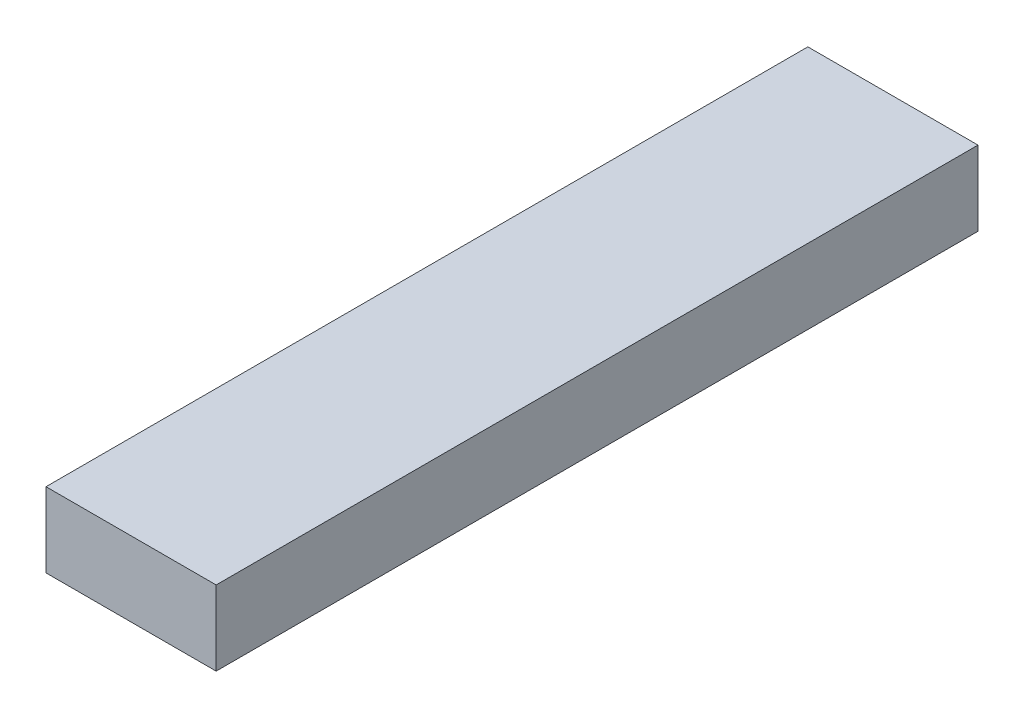
ISO-10303-21;
HEADER;
FILE_DESCRIPTION(('STEP AP214'),'2;1');
FILE_NAME('part.step','',(''),(''),'','','');
FILE_SCHEMA(('AUTOMOTIVE_DESIGN { 1 0 10303 214 1 1 1 1 }'));
ENDSEC;
DATA;
#1=APPLICATION_CONTEXT('core data for automotive mechanical design processes');
#2=APPLICATION_PROTOCOL_DEFINITION('international standard','automotive_design',2000,#1);
#3=PRODUCT_CONTEXT('',#1,'mechanical');
#4=PRODUCT('Part','Part','',(#3));
#5=PRODUCT_RELATED_PRODUCT_CATEGORY('part','',(#4));
#6=PRODUCT_DEFINITION_FORMATION('','',#4);
#7=PRODUCT_DEFINITION_CONTEXT('part definition',#1,'design');
#8=PRODUCT_DEFINITION('design','',#6,#7);
#9=PRODUCT_DEFINITION_SHAPE('','',#8);
#10=(LENGTH_UNIT() NAMED_UNIT(*) SI_UNIT(.MILLI.,.METRE.));
#11=(NAMED_UNIT(*) PLANE_ANGLE_UNIT() SI_UNIT($,.RADIAN.));
#12=(NAMED_UNIT(*) SI_UNIT($,.STERADIAN.) SOLID_ANGLE_UNIT());
#13=UNCERTAINTY_MEASURE_WITH_UNIT(LENGTH_MEASURE(1.E-05),#10,'distance_accuracy_value','');
#14=(GEOMETRIC_REPRESENTATION_CONTEXT(3) GLOBAL_UNCERTAINTY_ASSIGNED_CONTEXT((#13)) GLOBAL_UNIT_ASSIGNED_CONTEXT((#10,
#11,#12)) REPRESENTATION_CONTEXT('',''));
#15=CARTESIAN_POINT('',(0.,0.,0.));
#16=DIRECTION('',(0.,0.,1.));
#17=DIRECTION('',(1.,0.,0.));
#18=AXIS2_PLACEMENT_3D('',#15,#16,#17);
#19=CARTESIAN_POINT('',(17.018,-7.4676,76.2));
#20=DIRECTION('',(-1.,0.,0.));
#21=DIRECTION('',(0.,0.,1.));
#22=AXIS2_PLACEMENT_3D('',#19,#20,#21);
#23=PLANE('',#22);
#24=DIRECTION('',(0.,1.,0.));
#25=VECTOR('',#24,1.);
#26=CARTESIAN_POINT('',(17.018,-7.4676,-76.2));
#27=LINE('',#26,#25);
#28=CARTESIAN_POINT('',(17.018,-7.4676,-76.2));
#29=VERTEX_POINT('',#28);
#30=CARTESIAN_POINT('',(17.018,7.4676,-76.2));
#31=VERTEX_POINT('',#30);
#32=EDGE_CURVE('E107',#29,#31,#27,.T.);
#33=ORIENTED_EDGE('',*,*,#32,.T.);
#34=DIRECTION('',(0.,0.,-1.));
#35=VECTOR('',#34,1.);
#36=CARTESIAN_POINT('',(17.018,7.4676,76.2));
#37=LINE('',#36,#35);
#38=CARTESIAN_POINT('',(17.018,7.4676,76.2));
#39=VERTEX_POINT('',#38);
#40=EDGE_CURVE('E11',#39,#31,#37,.T.);
#41=ORIENTED_EDGE('',*,*,#40,.F.);
#42=DIRECTION('',(0.,1.,0.));
#43=VECTOR('',#42,1.);
#44=CARTESIAN_POINT('',(17.018,-7.4676,76.2));
#45=LINE('',#44,#43);
#46=CARTESIAN_POINT('',(17.018,-7.4676,76.2));
#47=VERTEX_POINT('',#46);
#48=EDGE_CURVE('E91',#47,#39,#45,.T.);
#49=ORIENTED_EDGE('',*,*,#48,.F.);
#50=DIRECTION('',(0.,0.,-1.));
#51=VECTOR('',#50,1.);
#52=CARTESIAN_POINT('',(17.018,-7.4676,76.2));
#53=LINE('',#52,#51);
#54=EDGE_CURVE('E103',#47,#29,#53,.T.);
#55=ORIENTED_EDGE('',*,*,#54,.T.);
#56=EDGE_LOOP('',(#33,#41,#49,#55));
#57=FACE_BOUND('',#56,.T.);
#58=ADVANCED_FACE('F39',(#57),#23,.F.);
#59=CARTESIAN_POINT('',(-17.018,7.4676,76.2));
#60=DIRECTION('',(0.,-1.,0.));
#61=DIRECTION('',(0.,0.,-1.));
#62=AXIS2_PLACEMENT_3D('',#59,#60,#61);
#63=PLANE('',#62);
#64=DIRECTION('',(-1.,0.,0.));
#65=VECTOR('',#64,1.);
#66=CARTESIAN_POINT('',(-17.018,7.4676,-76.2));
#67=LINE('',#66,#65);
#68=CARTESIAN_POINT('',(-17.018,7.4676,-76.2));
#69=VERTEX_POINT('',#68);
#70=EDGE_CURVE('E96',#31,#69,#67,.T.);
#71=ORIENTED_EDGE('',*,*,#70,.T.);
#72=DIRECTION('',(0.,0.,-1.));
#73=VECTOR('',#72,1.);
#74=CARTESIAN_POINT('',(-17.018,7.4676,76.2));
#75=LINE('',#74,#73);
#76=CARTESIAN_POINT('',(-17.018,7.4676,76.2));
#77=VERTEX_POINT('',#76);
#78=EDGE_CURVE('E48',#77,#69,#75,.T.);
#79=ORIENTED_EDGE('',*,*,#78,.F.);
#80=DIRECTION('',(-1.,0.,0.));
#81=VECTOR('',#80,1.);
#82=CARTESIAN_POINT('',(-17.018,7.4676,76.2));
#83=LINE('',#82,#81);
#84=EDGE_CURVE('E86',#39,#77,#83,.T.);
#85=ORIENTED_EDGE('',*,*,#84,.F.);
#86=ORIENTED_EDGE('',*,*,#40,.T.);
#87=EDGE_LOOP('',(#71,#79,#85,#86));
#88=FACE_BOUND('',#87,.T.);
#89=ADVANCED_FACE('F95',(#88),#63,.F.);
#90=CARTESIAN_POINT('',(-17.018,-7.4676,76.2));
#91=DIRECTION('',(1.,0.,0.));
#92=DIRECTION('',(0.,0.,-1.));
#93=AXIS2_PLACEMENT_3D('',#90,#91,#92);
#94=PLANE('',#93);
#95=DIRECTION('',(0.,-1.,0.));
#96=VECTOR('',#95,1.);
#97=CARTESIAN_POINT('',(-17.018,-7.4676,-76.2));
#98=LINE('',#97,#96);
#99=CARTESIAN_POINT('',(-17.018,-7.4676,-76.2));
#100=VERTEX_POINT('',#99);
#101=EDGE_CURVE('E73',#69,#100,#98,.T.);
#102=ORIENTED_EDGE('',*,*,#101,.T.);
#103=DIRECTION('',(0.,0.,-1.));
#104=VECTOR('',#103,1.);
#105=CARTESIAN_POINT('',(-17.018,-7.4676,76.2));
#106=LINE('',#105,#104);
#107=CARTESIAN_POINT('',(-17.018,-7.4676,76.2));
#108=VERTEX_POINT('',#107);
#109=EDGE_CURVE('E98',#108,#100,#106,.T.);
#110=ORIENTED_EDGE('',*,*,#109,.F.);
#111=DIRECTION('',(0.,-1.,0.));
#112=VECTOR('',#111,1.);
#113=CARTESIAN_POINT('',(-17.018,-7.4676,76.2));
#114=LINE('',#113,#112);
#115=EDGE_CURVE('E89',#77,#108,#114,.T.);
#116=ORIENTED_EDGE('',*,*,#115,.F.);
#117=ORIENTED_EDGE('',*,*,#78,.T.);
#118=EDGE_LOOP('',(#102,#110,#116,#117));
#119=FACE_BOUND('',#118,.T.);
#120=ADVANCED_FACE('F99',(#119),#94,.F.);
#121=CARTESIAN_POINT('',(-17.018,-7.4676,76.2));
#122=DIRECTION('',(0.,1.,0.));
#123=DIRECTION('',(0.,0.,1.));
#124=AXIS2_PLACEMENT_3D('',#121,#122,#123);
#125=PLANE('',#124);
#126=DIRECTION('',(1.,0.,0.));
#127=VECTOR('',#126,1.);
#128=CARTESIAN_POINT('',(-17.018,-7.4676,-76.2));
#129=LINE('',#128,#127);
#130=EDGE_CURVE('E79',#100,#29,#129,.T.);
#131=ORIENTED_EDGE('',*,*,#130,.T.);
#132=ORIENTED_EDGE('',*,*,#54,.F.);
#133=DIRECTION('',(1.,0.,0.));
#134=VECTOR('',#133,1.);
#135=CARTESIAN_POINT('',(-17.018,-7.4676,76.2));
#136=LINE('',#135,#134);
#137=EDGE_CURVE('E56',#108,#47,#136,.T.);
#138=ORIENTED_EDGE('',*,*,#137,.F.);
#139=ORIENTED_EDGE('',*,*,#109,.T.);
#140=EDGE_LOOP('',(#131,#132,#138,#139));
#141=FACE_BOUND('',#140,.T.);
#142=ADVANCED_FACE('F120',(#141),#125,.F.);
#143=CARTESIAN_POINT('',(0.,0.,76.2));
#144=DIRECTION('',(0.,0.,-1.));
#145=DIRECTION('',(-1.,0.,0.));
#146=AXIS2_PLACEMENT_3D('',#143,#144,#145);
#147=PLANE('',#146);
#148=ORIENTED_EDGE('',*,*,#48,.T.);
#149=ORIENTED_EDGE('',*,*,#84,.T.);
#150=ORIENTED_EDGE('',*,*,#115,.T.);
#151=ORIENTED_EDGE('',*,*,#137,.T.);
#152=EDGE_LOOP('',(#148,#149,#150,#151));
#153=FACE_BOUND('',#152,.T.);
#154=ADVANCED_FACE('F87',(#153),#147,.F.);
#155=CARTESIAN_POINT('',(0.,0.,-76.2));
#156=DIRECTION('',(0.,0.,-1.));
#157=DIRECTION('',(-1.,0.,0.));
#158=AXIS2_PLACEMENT_3D('',#155,#156,#157);
#159=PLANE('',#158);
#160=ORIENTED_EDGE('',*,*,#32,.F.);
#161=ORIENTED_EDGE('',*,*,#130,.F.);
#162=ORIENTED_EDGE('',*,*,#101,.F.);
#163=ORIENTED_EDGE('',*,*,#70,.F.);
#164=EDGE_LOOP('',(#160,#161,#162,#163));
#165=FACE_BOUND('',#164,.T.);
#166=ADVANCED_FACE('F123',(#165),#159,.T.);
#167=CLOSED_SHELL('',(#58,#89,#120,#142,#154,#166));
#168=MANIFOLD_SOLID_BREP('B2',#167);
#169=ADVANCED_BREP_SHAPE_REPRESENTATION('',(#18,#168),#14);
#170=SHAPE_DEFINITION_REPRESENTATION(#9,#169);
ENDSEC;
END-ISO-10303-21;
